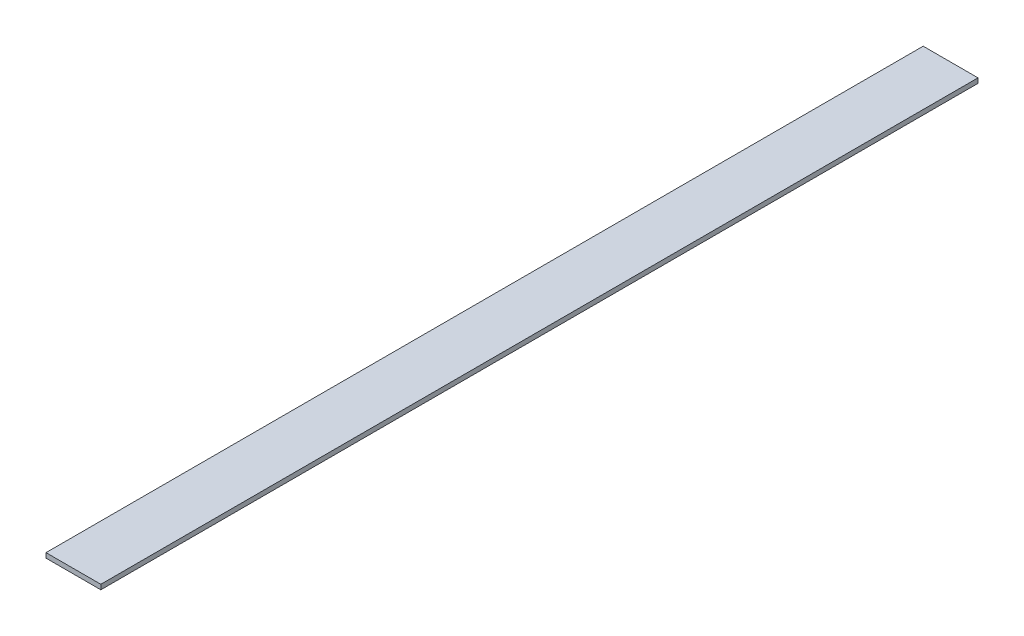
ISO-10303-21;
HEADER;
FILE_DESCRIPTION(('STEP AP214'),'2;1');
FILE_NAME('part.step','',(''),(''),'','','');
FILE_SCHEMA(('AUTOMOTIVE_DESIGN { 1 0 10303 214 1 1 1 1 }'));
ENDSEC;
DATA;
#1=APPLICATION_CONTEXT('core data for automotive mechanical design processes');
#2=APPLICATION_PROTOCOL_DEFINITION('international standard','automotive_design',2000,#1);
#3=PRODUCT_CONTEXT('',#1,'mechanical');
#4=PRODUCT('Part','Part','',(#3));
#5=PRODUCT_RELATED_PRODUCT_CATEGORY('part','',(#4));
#6=PRODUCT_DEFINITION_FORMATION('','',#4);
#7=PRODUCT_DEFINITION_CONTEXT('part definition',#1,'design');
#8=PRODUCT_DEFINITION('design','',#6,#7);
#9=PRODUCT_DEFINITION_SHAPE('','',#8);
#10=(LENGTH_UNIT() NAMED_UNIT(*) SI_UNIT(.MILLI.,.METRE.));
#11=(NAMED_UNIT(*) PLANE_ANGLE_UNIT() SI_UNIT($,.RADIAN.));
#12=(NAMED_UNIT(*) SI_UNIT($,.STERADIAN.) SOLID_ANGLE_UNIT());
#13=UNCERTAINTY_MEASURE_WITH_UNIT(LENGTH_MEASURE(1.E-05),#10,'distance_accuracy_value','');
#14=(GEOMETRIC_REPRESENTATION_CONTEXT(3) GLOBAL_UNCERTAINTY_ASSIGNED_CONTEXT((#13)) GLOBAL_UNIT_ASSIGNED_CONTEXT((#10,
#11,#12)) REPRESENTATION_CONTEXT('',''));
#15=CARTESIAN_POINT('',(0.,0.,0.));
#16=DIRECTION('',(0.,0.,1.));
#17=DIRECTION('',(1.,0.,0.));
#18=AXIS2_PLACEMENT_3D('',#15,#16,#17);
#19=CARTESIAN_POINT('',(57.1500000000003,5.,914.4));
#20=DIRECTION('',(0.,0.,1.));
#21=DIRECTION('',(1.,0.,0.));
#22=AXIS2_PLACEMENT_3D('',#19,#20,#21);
#23=PLANE('',#22);
#24=DIRECTION('',(-1.,0.,0.));
#25=VECTOR('',#24,1.);
#26=CARTESIAN_POINT('',(57.1500000000003,0.,914.4));
#27=LINE('',#26,#25);
#28=CARTESIAN_POINT('',(57.1500000000003,0.,914.4));
#29=VERTEX_POINT('',#28);
#30=CARTESIAN_POINT('',(2.80926168756661E-13,0.,914.4));
#31=VERTEX_POINT('',#30);
#32=EDGE_CURVE('E110',#29,#31,#27,.T.);
#33=ORIENTED_EDGE('',*,*,#32,.F.);
#34=DIRECTION('',(0.,-1.,0.));
#35=VECTOR('',#34,1.);
#36=CARTESIAN_POINT('',(57.1500000000003,5.,914.4));
#37=LINE('',#36,#35);
#38=CARTESIAN_POINT('',(57.1500000000003,5.,914.4));
#39=VERTEX_POINT('',#38);
#40=EDGE_CURVE('E11',#39,#29,#37,.T.);
#41=ORIENTED_EDGE('',*,*,#40,.F.);
#42=DIRECTION('',(-1.,0.,0.));
#43=VECTOR('',#42,1.);
#44=CARTESIAN_POINT('',(57.1500000000003,5.,914.4));
#45=LINE('',#44,#43);
#46=CARTESIAN_POINT('',(2.80926168756661E-13,5.,914.4));
#47=VERTEX_POINT('',#46);
#48=EDGE_CURVE('E102',#39,#47,#45,.T.);
#49=ORIENTED_EDGE('',*,*,#48,.T.);
#50=DIRECTION('',(0.,-1.,0.));
#51=VECTOR('',#50,1.);
#52=CARTESIAN_POINT('',(2.80926168756661E-13,5.,914.4));
#53=LINE('',#52,#51);
#54=EDGE_CURVE('E43',#47,#31,#53,.T.);
#55=ORIENTED_EDGE('',*,*,#54,.T.);
#56=EDGE_LOOP('',(#33,#41,#49,#55));
#57=FACE_BOUND('',#56,.T.);
#58=ADVANCED_FACE('F40',(#57),#23,.T.);
#59=CARTESIAN_POINT('',(57.1499999999999,5.,0.));
#60=DIRECTION('',(1.,0.,0.));
#61=DIRECTION('',(0.,0.,-1.));
#62=AXIS2_PLACEMENT_3D('',#59,#60,#61);
#63=PLANE('',#62);
#64=DIRECTION('',(0.,0.,1.));
#65=VECTOR('',#64,1.);
#66=CARTESIAN_POINT('',(57.1499999999999,0.,0.));
#67=LINE('',#66,#65);
#68=CARTESIAN_POINT('',(57.1499999999999,0.,0.));
#69=VERTEX_POINT('',#68);
#70=EDGE_CURVE('E105',#69,#29,#67,.T.);
#71=ORIENTED_EDGE('',*,*,#70,.F.);
#72=DIRECTION('',(0.,-1.,0.));
#73=VECTOR('',#72,1.);
#74=CARTESIAN_POINT('',(57.1499999999999,5.,0.));
#75=LINE('',#74,#73);
#76=CARTESIAN_POINT('',(57.1499999999999,5.,0.));
#77=VERTEX_POINT('',#76);
#78=EDGE_CURVE('E50',#77,#69,#75,.T.);
#79=ORIENTED_EDGE('',*,*,#78,.F.);
#80=DIRECTION('',(0.,0.,1.));
#81=VECTOR('',#80,1.);
#82=CARTESIAN_POINT('',(57.1499999999999,5.,0.));
#83=LINE('',#82,#81);
#84=EDGE_CURVE('E97',#77,#39,#83,.T.);
#85=ORIENTED_EDGE('',*,*,#84,.T.);
#86=ORIENTED_EDGE('',*,*,#40,.T.);
#87=EDGE_LOOP('',(#71,#79,#85,#86));
#88=FACE_BOUND('',#87,.T.);
#89=ADVANCED_FACE('F126',(#88),#63,.T.);
#90=CARTESIAN_POINT('',(0.,5.,0.));
#91=DIRECTION('',(0.,0.,-1.));
#92=DIRECTION('',(-1.,0.,0.));
#93=AXIS2_PLACEMENT_3D('',#90,#91,#92);
#94=PLANE('',#93);
#95=DIRECTION('',(1.,0.,0.));
#96=VECTOR('',#95,1.);
#97=CARTESIAN_POINT('',(0.,0.,0.));
#98=LINE('',#97,#96);
#99=CARTESIAN_POINT('',(0.,0.,0.));
#100=VERTEX_POINT('',#99);
#101=EDGE_CURVE('E91',#100,#69,#98,.T.);
#102=ORIENTED_EDGE('',*,*,#101,.F.);
#103=DIRECTION('',(0.,-1.,0.));
#104=VECTOR('',#103,1.);
#105=CARTESIAN_POINT('',(0.,5.,0.));
#106=LINE('',#105,#104);
#107=CARTESIAN_POINT('',(0.,5.,0.));
#108=VERTEX_POINT('',#107);
#109=EDGE_CURVE('E86',#108,#100,#106,.T.);
#110=ORIENTED_EDGE('',*,*,#109,.F.);
#111=DIRECTION('',(1.,0.,0.));
#112=VECTOR('',#111,1.);
#113=CARTESIAN_POINT('',(0.,5.,0.));
#114=LINE('',#113,#112);
#115=EDGE_CURVE('E89',#108,#77,#114,.T.);
#116=ORIENTED_EDGE('',*,*,#115,.T.);
#117=ORIENTED_EDGE('',*,*,#78,.T.);
#118=EDGE_LOOP('',(#102,#110,#116,#117));
#119=FACE_BOUND('',#118,.T.);
#120=ADVANCED_FACE('F88',(#119),#94,.T.);
#121=CARTESIAN_POINT('',(2.80926168756661E-13,5.,914.4));
#122=DIRECTION('',(-1.,0.,0.));
#123=DIRECTION('',(0.,0.,1.));
#124=AXIS2_PLACEMENT_3D('',#121,#122,#123);
#125=PLANE('',#124);
#126=DIRECTION('',(0.,0.,-1.));
#127=VECTOR('',#126,1.);
#128=CARTESIAN_POINT('',(2.80926168756661E-13,0.,914.4));
#129=LINE('',#128,#127);
#130=EDGE_CURVE('E114',#31,#100,#129,.T.);
#131=ORIENTED_EDGE('',*,*,#130,.F.);
#132=ORIENTED_EDGE('',*,*,#54,.F.);
#133=DIRECTION('',(0.,0.,-1.));
#134=VECTOR('',#133,1.);
#135=CARTESIAN_POINT('',(2.80926168756661E-13,5.,914.4));
#136=LINE('',#135,#134);
#137=EDGE_CURVE('E96',#47,#108,#136,.T.);
#138=ORIENTED_EDGE('',*,*,#137,.T.);
#139=ORIENTED_EDGE('',*,*,#109,.T.);
#140=EDGE_LOOP('',(#131,#132,#138,#139));
#141=FACE_BOUND('',#140,.T.);
#142=ADVANCED_FACE('F100',(#141),#125,.T.);
#143=CARTESIAN_POINT('',(0.,5.,0.));
#144=DIRECTION('',(0.,-1.,0.));
#145=DIRECTION('',(0.,0.,-1.));
#146=AXIS2_PLACEMENT_3D('',#143,#144,#145);
#147=PLANE('',#146);
#148=ORIENTED_EDGE('',*,*,#48,.F.);
#149=ORIENTED_EDGE('',*,*,#84,.F.);
#150=ORIENTED_EDGE('',*,*,#115,.F.);
#151=ORIENTED_EDGE('',*,*,#137,.F.);
#152=EDGE_LOOP('',(#148,#149,#150,#151));
#153=FACE_BOUND('',#152,.T.);
#154=ADVANCED_FACE('F95',(#153),#147,.F.);
#155=CARTESIAN_POINT('',(0.,0.,0.));
#156=DIRECTION('',(0.,-1.,0.));
#157=DIRECTION('',(0.,0.,-1.));
#158=AXIS2_PLACEMENT_3D('',#155,#156,#157);
#159=PLANE('',#158);
#160=ORIENTED_EDGE('',*,*,#32,.T.);
#161=ORIENTED_EDGE('',*,*,#130,.T.);
#162=ORIENTED_EDGE('',*,*,#101,.T.);
#163=ORIENTED_EDGE('',*,*,#70,.T.);
#164=EDGE_LOOP('',(#160,#161,#162,#163));
#165=FACE_BOUND('',#164,.T.);
#166=ADVANCED_FACE('F125',(#165),#159,.T.);
#167=CLOSED_SHELL('',(#58,#89,#120,#142,#154,#166));
#168=MANIFOLD_SOLID_BREP('B2',#167);
#169=ADVANCED_BREP_SHAPE_REPRESENTATION('',(#18,#168),#14);
#170=SHAPE_DEFINITION_REPRESENTATION(#9,#169);
ENDSEC;
END-ISO-10303-21;
